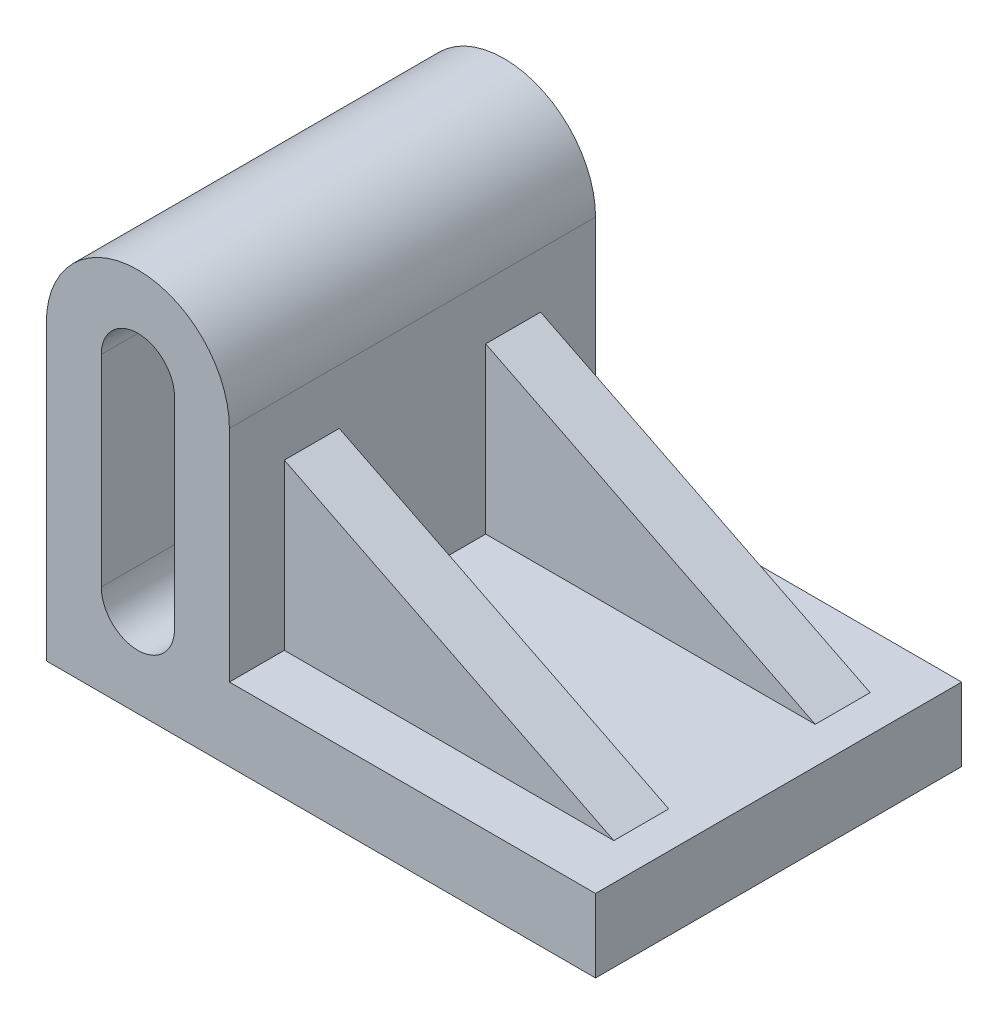
ISO-10303-21;
HEADER;
FILE_DESCRIPTION(('STEP AP214'),'2;1');
FILE_NAME('part.step','',(''),(''),'','','');
FILE_SCHEMA(('AUTOMOTIVE_DESIGN { 1 0 10303 214 1 1 1 1 }'));
ENDSEC;
DATA;
#1=APPLICATION_CONTEXT('core data for automotive mechanical design processes');
#2=APPLICATION_PROTOCOL_DEFINITION('international standard','automotive_design',2000,#1);
#3=PRODUCT_CONTEXT('',#1,'mechanical');
#4=PRODUCT('Part','Part','',(#3));
#5=PRODUCT_RELATED_PRODUCT_CATEGORY('part','',(#4));
#6=PRODUCT_DEFINITION_FORMATION('','',#4);
#7=PRODUCT_DEFINITION_CONTEXT('part definition',#1,'design');
#8=PRODUCT_DEFINITION('design','',#6,#7);
#9=PRODUCT_DEFINITION_SHAPE('','',#8);
#10=(LENGTH_UNIT() NAMED_UNIT(*) SI_UNIT(.MILLI.,.METRE.));
#11=(NAMED_UNIT(*) PLANE_ANGLE_UNIT() SI_UNIT($,.RADIAN.));
#12=(NAMED_UNIT(*) SI_UNIT($,.STERADIAN.) SOLID_ANGLE_UNIT());
#13=UNCERTAINTY_MEASURE_WITH_UNIT(LENGTH_MEASURE(1.E-05),#10,'distance_accuracy_value','');
#14=(GEOMETRIC_REPRESENTATION_CONTEXT(3) GLOBAL_UNCERTAINTY_ASSIGNED_CONTEXT((#13)) GLOBAL_UNIT_ASSIGNED_CONTEXT((#10,
#11,#12)) REPRESENTATION_CONTEXT('',''));
#15=CARTESIAN_POINT('',(0.,0.,0.));
#16=DIRECTION('',(0.,0.,1.));
#17=DIRECTION('',(1.,0.,0.));
#18=AXIS2_PLACEMENT_3D('',#15,#16,#17);
#19=CARTESIAN_POINT('',(140.,20.,-35.));
#20=DIRECTION('',(0.447213595499958,0.894427190999916,0.));
#21=DIRECTION('',(-0.894427190999916,0.447213595499958,0.));
#22=AXIS2_PLACEMENT_3D('',#19,#20,#21);
#23=PLANE('',#22);
#24=DIRECTION('',(0.,0.,1.));
#25=VECTOR('',#24,1.);
#26=CARTESIAN_POINT('',(140.,20.,-35.));
#27=LINE('',#26,#25);
#28=CARTESIAN_POINT('',(140.,20.,20.));
#29=VERTEX_POINT('',#28);
#30=CARTESIAN_POINT('',(140.,20.,35.));
#31=VERTEX_POINT('',#30);
#32=EDGE_CURVE('E211',#29,#31,#27,.T.);
#33=ORIENTED_EDGE('',*,*,#32,.F.);
#34=DIRECTION('',(-0.894427190999916,0.447213595499958,0.));
#35=VECTOR('',#34,1.);
#36=CARTESIAN_POINT('',(140.,20.,20.));
#37=LINE('',#36,#35);
#38=CARTESIAN_POINT('',(50.,65.,20.));
#39=VERTEX_POINT('',#38);
#40=EDGE_CURVE('E11',#29,#39,#37,.T.);
#41=ORIENTED_EDGE('',*,*,#40,.T.);
#42=DIRECTION('',(0.,0.,1.));
#43=VECTOR('',#42,1.);
#44=CARTESIAN_POINT('',(50.,65.,-35.));
#45=LINE('',#44,#43);
#46=CARTESIAN_POINT('',(50.,65.,35.));
#47=VERTEX_POINT('',#46);
#48=EDGE_CURVE('E68',#39,#47,#45,.T.);
#49=ORIENTED_EDGE('',*,*,#48,.T.);
#50=DIRECTION('',(-0.894427190999916,0.447213595499958,0.));
#51=VECTOR('',#50,1.);
#52=CARTESIAN_POINT('',(140.,20.,35.));
#53=LINE('',#52,#51);
#54=EDGE_CURVE('E168',#31,#47,#53,.T.);
#55=ORIENTED_EDGE('',*,*,#54,.F.);
#56=EDGE_LOOP('',(#33,#41,#49,#55));
#57=FACE_BOUND('',#56,.T.);
#58=ADVANCED_FACE('F45',(#57),#23,.T.);
#59=CARTESIAN_POINT('',(50.,65.,-35.));
#60=VERTEX_POINT('',#59);
#61=CARTESIAN_POINT('',(50.,65.,-20.));
#62=VERTEX_POINT('',#61);
#63=EDGE_CURVE('E212',#60,#62,#45,.T.);
#64=ORIENTED_EDGE('',*,*,#63,.T.);
#65=DIRECTION('',(0.894427190999916,-0.447213595499958,0.));
#66=VECTOR('',#65,1.);
#67=CARTESIAN_POINT('',(140.,20.,-20.));
#68=LINE('',#67,#66);
#69=CARTESIAN_POINT('',(140.,20.,-20.));
#70=VERTEX_POINT('',#69);
#71=EDGE_CURVE('E54',#62,#70,#68,.T.);
#72=ORIENTED_EDGE('',*,*,#71,.T.);
#73=CARTESIAN_POINT('',(140.,20.,-35.));
#74=VERTEX_POINT('',#73);
#75=EDGE_CURVE('E207',#74,#70,#27,.T.);
#76=ORIENTED_EDGE('',*,*,#75,.F.);
#77=DIRECTION('',(-0.894427190999916,0.447213595499958,0.));
#78=VECTOR('',#77,1.);
#79=CARTESIAN_POINT('',(140.,20.,-35.));
#80=LINE('',#79,#78);
#81=EDGE_CURVE('E195',#74,#60,#80,.T.);
#82=ORIENTED_EDGE('',*,*,#81,.T.);
#83=EDGE_LOOP('',(#64,#72,#76,#82));
#84=FACE_BOUND('',#83,.T.);
#85=ADVANCED_FACE('F323',(#84),#23,.T.);
#86=CARTESIAN_POINT('',(0.,20.,50.));
#87=DIRECTION('',(0.,-1.,0.));
#88=DIRECTION('',(1.,0.,0.));
#89=AXIS2_PLACEMENT_3D('',#86,#87,#88);
#90=PLANE('',#89);
#91=DIRECTION('',(0.,0.,-1.));
#92=VECTOR('',#91,1.);
#93=CARTESIAN_POINT('',(150.,20.,50.));
#94=LINE('',#93,#92);
#95=CARTESIAN_POINT('',(150.,20.,50.));
#96=VERTEX_POINT('',#95);
#97=CARTESIAN_POINT('',(150.,20.,-50.));
#98=VERTEX_POINT('',#97);
#99=EDGE_CURVE('E309',#96,#98,#94,.T.);
#100=ORIENTED_EDGE('',*,*,#99,.T.);
#101=DIRECTION('',(-1.,0.,0.));
#102=VECTOR('',#101,1.);
#103=CARTESIAN_POINT('',(0.,20.,-50.));
#104=LINE('',#103,#102);
#105=CARTESIAN_POINT('',(50.,20.,-50.));
#106=VERTEX_POINT('',#105);
#107=EDGE_CURVE('E275',#98,#106,#104,.T.);
#108=ORIENTED_EDGE('',*,*,#107,.T.);
#109=DIRECTION('',(0.,0.,-1.));
#110=VECTOR('',#109,1.);
#111=CARTESIAN_POINT('',(50.,20.,50.));
#112=LINE('',#111,#110);
#113=CARTESIAN_POINT('',(50.,20.,-35.));
#114=VERTEX_POINT('',#113);
#115=EDGE_CURVE('E304',#114,#106,#112,.T.);
#116=ORIENTED_EDGE('',*,*,#115,.F.);
#117=DIRECTION('',(1.,0.,0.));
#118=VECTOR('',#117,1.);
#119=CARTESIAN_POINT('',(50.,20.,-35.));
#120=LINE('',#119,#118);
#121=EDGE_CURVE('E203',#114,#74,#120,.T.);
#122=ORIENTED_EDGE('',*,*,#121,.T.);
#123=ORIENTED_EDGE('',*,*,#75,.T.);
#124=DIRECTION('',(-1.,0.,0.));
#125=VECTOR('',#124,1.);
#126=CARTESIAN_POINT('',(50.,20.,-20.));
#127=LINE('',#126,#125);
#128=CARTESIAN_POINT('',(50.,20.,-20.));
#129=VERTEX_POINT('',#128);
#130=EDGE_CURVE('E174',#70,#129,#127,.T.);
#131=ORIENTED_EDGE('',*,*,#130,.T.);
#132=DIRECTION('',(0.,0.,1.));
#133=VECTOR('',#132,1.);
#134=CARTESIAN_POINT('',(50.,20.,-20.));
#135=LINE('',#134,#133);
#136=CARTESIAN_POINT('',(50.,20.,20.));
#137=VERTEX_POINT('',#136);
#138=EDGE_CURVE('E164',#129,#137,#135,.T.);
#139=ORIENTED_EDGE('',*,*,#138,.T.);
#140=DIRECTION('',(1.,0.,0.));
#141=VECTOR('',#140,1.);
#142=CARTESIAN_POINT('',(50.,20.,20.));
#143=LINE('',#142,#141);
#144=EDGE_CURVE('E61',#137,#29,#143,.T.);
#145=ORIENTED_EDGE('',*,*,#144,.T.);
#146=ORIENTED_EDGE('',*,*,#32,.T.);
#147=DIRECTION('',(1.,0.,0.));
#148=VECTOR('',#147,1.);
#149=CARTESIAN_POINT('',(50.,20.,35.));
#150=LINE('',#149,#148);
#151=CARTESIAN_POINT('',(50.,20.,35.));
#152=VERTEX_POINT('',#151);
#153=EDGE_CURVE('E191',#152,#31,#150,.T.);
#154=ORIENTED_EDGE('',*,*,#153,.F.);
#155=CARTESIAN_POINT('',(50.,20.,50.));
#156=VERTEX_POINT('',#155);
#157=EDGE_CURVE('E305',#156,#152,#112,.T.);
#158=ORIENTED_EDGE('',*,*,#157,.F.);
#159=DIRECTION('',(-1.,0.,0.));
#160=VECTOR('',#159,1.);
#161=CARTESIAN_POINT('',(0.,20.,50.));
#162=LINE('',#161,#160);
#163=EDGE_CURVE('E295',#96,#156,#162,.T.);
#164=ORIENTED_EDGE('',*,*,#163,.F.);
#165=EDGE_LOOP('',(#100,#108,#116,#122,#123,#131,#139,#145,#146,#154,#158,#164));
#166=FACE_BOUND('',#165,.T.);
#167=ADVANCED_FACE('F177',(#166),#90,.F.);
#168=CARTESIAN_POINT('',(50.,0.,50.));
#169=DIRECTION('',(-1.,0.,0.));
#170=DIRECTION('',(0.,0.,1.));
#171=AXIS2_PLACEMENT_3D('',#168,#169,#170);
#172=PLANE('',#171);
#173=DIRECTION('',(0.,1.,0.));
#174=VECTOR('',#173,1.);
#175=CARTESIAN_POINT('',(50.,0.,-50.));
#176=LINE('',#175,#174);
#177=CARTESIAN_POINT('',(50.,80.,-50.));
#178=VERTEX_POINT('',#177);
#179=EDGE_CURVE('E279',#106,#178,#176,.T.);
#180=ORIENTED_EDGE('',*,*,#179,.T.);
#181=DIRECTION('',(0.,0.,-1.));
#182=VECTOR('',#181,1.);
#183=CARTESIAN_POINT('',(50.,80.,50.));
#184=LINE('',#183,#182);
#185=CARTESIAN_POINT('',(50.,80.,50.));
#186=VERTEX_POINT('',#185);
#187=EDGE_CURVE('E301',#186,#178,#184,.T.);
#188=ORIENTED_EDGE('',*,*,#187,.F.);
#189=DIRECTION('',(0.,1.,0.));
#190=VECTOR('',#189,1.);
#191=CARTESIAN_POINT('',(50.,0.,50.));
#192=LINE('',#191,#190);
#193=EDGE_CURVE('E298',#156,#186,#192,.T.);
#194=ORIENTED_EDGE('',*,*,#193,.F.);
#195=ORIENTED_EDGE('',*,*,#157,.T.);
#196=DIRECTION('',(0.,-1.,0.));
#197=VECTOR('',#196,1.);
#198=CARTESIAN_POINT('',(50.,65.,35.));
#199=LINE('',#198,#197);
#200=EDGE_CURVE('E188',#47,#152,#199,.T.);
#201=ORIENTED_EDGE('',*,*,#200,.F.);
#202=ORIENTED_EDGE('',*,*,#48,.F.);
#203=DIRECTION('',(0.,-1.,0.));
#204=VECTOR('',#203,1.);
#205=CARTESIAN_POINT('',(50.,105.,20.));
#206=LINE('',#205,#204);
#207=EDGE_CURVE('E160',#39,#137,#206,.T.);
#208=ORIENTED_EDGE('',*,*,#207,.T.);
#209=ORIENTED_EDGE('',*,*,#138,.F.);
#210=DIRECTION('',(0.,-1.,0.));
#211=VECTOR('',#210,1.);
#212=CARTESIAN_POINT('',(50.,105.,-20.));
#213=LINE('',#212,#211);
#214=EDGE_CURVE('E169',#62,#129,#213,.T.);
#215=ORIENTED_EDGE('',*,*,#214,.F.);
#216=ORIENTED_EDGE('',*,*,#63,.F.);
#217=DIRECTION('',(0.,-1.,0.));
#218=VECTOR('',#217,1.);
#219=CARTESIAN_POINT('',(50.,65.,-35.));
#220=LINE('',#219,#218);
#221=EDGE_CURVE('E199',#60,#114,#220,.T.);
#222=ORIENTED_EDGE('',*,*,#221,.T.);
#223=ORIENTED_EDGE('',*,*,#115,.T.);
#224=EDGE_LOOP('',(#180,#188,#194,#195,#201,#202,#208,#209,#215,#216,#222,#223));
#225=FACE_BOUND('',#224,.T.);
#226=ADVANCED_FACE('F162',(#225),#172,.F.);
#227=CARTESIAN_POINT('',(25.,80.,50.));
#228=DIRECTION('',(0.,0.,-1.));
#229=DIRECTION('',(-1.,0.,0.));
#230=AXIS2_PLACEMENT_3D('',#227,#228,#229);
#231=CYLINDRICAL_SURFACE('',#230,25.);
#232=ORIENTED_EDGE('',*,*,#187,.T.);
#233=CARTESIAN_POINT('',(25.,80.,-50.));
#234=DIRECTION('',(0.,0.,1.));
#235=DIRECTION('',(1.,0.,0.));
#236=AXIS2_PLACEMENT_3D('',#233,#234,#235);
#237=CIRCLE('',#236,25.);
#238=CARTESIAN_POINT('',(0.,80.,-50.));
#239=VERTEX_POINT('',#238);
#240=EDGE_CURVE('E250',#178,#239,#237,.T.);
#241=ORIENTED_EDGE('',*,*,#240,.T.);
#242=DIRECTION('',(0.,0.,-1.));
#243=VECTOR('',#242,1.);
#244=CARTESIAN_POINT('',(0.,80.,50.));
#245=LINE('',#244,#243);
#246=CARTESIAN_POINT('',(0.,80.,50.));
#247=VERTEX_POINT('',#246);
#248=EDGE_CURVE('E318',#247,#239,#245,.T.);
#249=ORIENTED_EDGE('',*,*,#248,.F.);
#250=CARTESIAN_POINT('',(25.,80.,50.));
#251=DIRECTION('',(0.,0.,1.));
#252=DIRECTION('',(1.,0.,0.));
#253=AXIS2_PLACEMENT_3D('',#250,#251,#252);
#254=CIRCLE('',#253,25.);
#255=EDGE_CURVE('E282',#186,#247,#254,.T.);
#256=ORIENTED_EDGE('',*,*,#255,.F.);
#257=EDGE_LOOP('',(#232,#241,#249,#256));
#258=FACE_BOUND('',#257,.T.);
#259=ADVANCED_FACE('F47',(#258),#231,.T.);
#260=CARTESIAN_POINT('',(0.,0.,50.));
#261=DIRECTION('',(1.,0.,0.));
#262=DIRECTION('',(0.,0.,-1.));
#263=AXIS2_PLACEMENT_3D('',#260,#261,#262);
#264=PLANE('',#263);
#265=ORIENTED_EDGE('',*,*,#248,.T.);
#266=DIRECTION('',(0.,-1.,0.));
#267=VECTOR('',#266,1.);
#268=CARTESIAN_POINT('',(0.,0.,-50.));
#269=LINE('',#268,#267);
#270=CARTESIAN_POINT('',(0.,0.,-50.));
#271=VERTEX_POINT('',#270);
#272=EDGE_CURVE('E263',#239,#271,#269,.T.);
#273=ORIENTED_EDGE('',*,*,#272,.T.);
#274=DIRECTION('',(0.,0.,-1.));
#275=VECTOR('',#274,1.);
#276=CARTESIAN_POINT('',(0.,0.,50.));
#277=LINE('',#276,#275);
#278=CARTESIAN_POINT('',(0.,0.,50.));
#279=VERTEX_POINT('',#278);
#280=EDGE_CURVE('E315',#279,#271,#277,.T.);
#281=ORIENTED_EDGE('',*,*,#280,.F.);
#282=DIRECTION('',(0.,-1.,0.));
#283=VECTOR('',#282,1.);
#284=CARTESIAN_POINT('',(0.,0.,50.));
#285=LINE('',#284,#283);
#286=EDGE_CURVE('E286',#247,#279,#285,.T.);
#287=ORIENTED_EDGE('',*,*,#286,.F.);
#288=EDGE_LOOP('',(#265,#273,#281,#287));
#289=FACE_BOUND('',#288,.T.);
#290=ADVANCED_FACE('F381',(#289),#264,.F.);
#291=CARTESIAN_POINT('',(0.,0.,50.));
#292=DIRECTION('',(0.,1.,0.));
#293=DIRECTION('',(0.,0.,1.));
#294=AXIS2_PLACEMENT_3D('',#291,#292,#293);
#295=PLANE('',#294);
#296=ORIENTED_EDGE('',*,*,#280,.T.);
#297=DIRECTION('',(1.,0.,0.));
#298=VECTOR('',#297,1.);
#299=CARTESIAN_POINT('',(0.,0.,-50.));
#300=LINE('',#299,#298);
#301=CARTESIAN_POINT('',(150.,0.,-50.));
#302=VERTEX_POINT('',#301);
#303=EDGE_CURVE('E267',#271,#302,#300,.T.);
#304=ORIENTED_EDGE('',*,*,#303,.T.);
#305=DIRECTION('',(0.,0.,-1.));
#306=VECTOR('',#305,1.);
#307=CARTESIAN_POINT('',(150.,0.,50.));
#308=LINE('',#307,#306);
#309=CARTESIAN_POINT('',(150.,0.,50.));
#310=VERTEX_POINT('',#309);
#311=EDGE_CURVE('E312',#310,#302,#308,.T.);
#312=ORIENTED_EDGE('',*,*,#311,.F.);
#313=DIRECTION('',(1.,0.,0.));
#314=VECTOR('',#313,1.);
#315=CARTESIAN_POINT('',(0.,0.,50.));
#316=LINE('',#315,#314);
#317=EDGE_CURVE('E289',#279,#310,#316,.T.);
#318=ORIENTED_EDGE('',*,*,#317,.F.);
#319=EDGE_LOOP('',(#296,#304,#312,#318));
#320=FACE_BOUND('',#319,.T.);
#321=ADVANCED_FACE('F378',(#320),#295,.F.);
#322=CARTESIAN_POINT('',(150.,0.,50.));
#323=DIRECTION('',(-1.,0.,0.));
#324=DIRECTION('',(0.,0.,1.));
#325=AXIS2_PLACEMENT_3D('',#322,#323,#324);
#326=PLANE('',#325);
#327=ORIENTED_EDGE('',*,*,#311,.T.);
#328=DIRECTION('',(0.,1.,0.));
#329=VECTOR('',#328,1.);
#330=CARTESIAN_POINT('',(150.,0.,-50.));
#331=LINE('',#330,#329);
#332=EDGE_CURVE('E271',#302,#98,#331,.T.);
#333=ORIENTED_EDGE('',*,*,#332,.T.);
#334=ORIENTED_EDGE('',*,*,#99,.F.);
#335=DIRECTION('',(0.,1.,0.));
#336=VECTOR('',#335,1.);
#337=CARTESIAN_POINT('',(150.,0.,50.));
#338=LINE('',#337,#336);
#339=EDGE_CURVE('E292',#310,#96,#338,.T.);
#340=ORIENTED_EDGE('',*,*,#339,.F.);
#341=EDGE_LOOP('',(#327,#333,#334,#340));
#342=FACE_BOUND('',#341,.T.);
#343=ADVANCED_FACE('F370',(#342),#326,.F.);
#344=CARTESIAN_POINT('',(0.,0.,50.));
#345=DIRECTION('',(0.,0.,1.));
#346=DIRECTION('',(1.,0.,0.));
#347=AXIS2_PLACEMENT_3D('',#344,#345,#346);
#348=PLANE('',#347);
#349=CARTESIAN_POINT('',(25.,80.,50.));
#350=DIRECTION('',(0.,0.,1.));
#351=DIRECTION('',(1.,0.,0.));
#352=AXIS2_PLACEMENT_3D('',#349,#350,#351);
#353=CIRCLE('',#352,10.);
#354=CARTESIAN_POINT('',(35.,80.,50.));
#355=VERTEX_POINT('',#354);
#356=CARTESIAN_POINT('',(15.,80.,50.));
#357=VERTEX_POINT('',#356);
#358=EDGE_CURVE('E210',#355,#357,#353,.T.);
#359=ORIENTED_EDGE('',*,*,#358,.F.);
#360=DIRECTION('',(0.,1.,0.));
#361=VECTOR('',#360,1.);
#362=CARTESIAN_POINT('',(35.,80.,50.));
#363=LINE('',#362,#361);
#364=CARTESIAN_POINT('',(35.,25.,50.));
#365=VERTEX_POINT('',#364);
#366=EDGE_CURVE('E221',#365,#355,#363,.T.);
#367=ORIENTED_EDGE('',*,*,#366,.F.);
#368=CARTESIAN_POINT('',(25.,25.,50.));
#369=DIRECTION('',(0.,0.,1.));
#370=DIRECTION('',(1.,0.,0.));
#371=AXIS2_PLACEMENT_3D('',#368,#369,#370);
#372=CIRCLE('',#371,10.);
#373=CARTESIAN_POINT('',(15.,25.,50.));
#374=VERTEX_POINT('',#373);
#375=EDGE_CURVE('E240',#374,#365,#372,.T.);
#376=ORIENTED_EDGE('',*,*,#375,.F.);
#377=DIRECTION('',(0.,-1.,0.));
#378=VECTOR('',#377,1.);
#379=CARTESIAN_POINT('',(15.,80.,50.));
#380=LINE('',#379,#378);
#381=EDGE_CURVE('E236',#357,#374,#380,.T.);
#382=ORIENTED_EDGE('',*,*,#381,.F.);
#383=EDGE_LOOP('',(#359,#367,#376,#382));
#384=FACE_BOUND('',#383,.T.);
#385=ORIENTED_EDGE('',*,*,#255,.T.);
#386=ORIENTED_EDGE('',*,*,#286,.T.);
#387=ORIENTED_EDGE('',*,*,#317,.T.);
#388=ORIENTED_EDGE('',*,*,#339,.T.);
#389=ORIENTED_EDGE('',*,*,#163,.T.);
#390=ORIENTED_EDGE('',*,*,#193,.T.);
#391=EDGE_LOOP('',(#385,#386,#387,#388,#389,#390));
#392=FACE_BOUND('',#391,.T.);
#393=ADVANCED_FACE('F366',(#384,#392),#348,.T.);
#394=CARTESIAN_POINT('',(0.,0.,-50.));
#395=DIRECTION('',(0.,0.,1.));
#396=DIRECTION('',(1.,0.,0.));
#397=AXIS2_PLACEMENT_3D('',#394,#395,#396);
#398=PLANE('',#397);
#399=DIRECTION('',(0.,1.,0.));
#400=VECTOR('',#399,1.);
#401=CARTESIAN_POINT('',(35.,80.,-50.));
#402=LINE('',#401,#400);
#403=CARTESIAN_POINT('',(35.,25.,-50.));
#404=VERTEX_POINT('',#403);
#405=CARTESIAN_POINT('',(35.,80.,-50.));
#406=VERTEX_POINT('',#405);
#407=EDGE_CURVE('E229',#404,#406,#402,.T.);
#408=ORIENTED_EDGE('',*,*,#407,.T.);
#409=CARTESIAN_POINT('',(25.,80.,-50.));
#410=DIRECTION('',(0.,0.,1.));
#411=DIRECTION('',(1.,0.,0.));
#412=AXIS2_PLACEMENT_3D('',#409,#410,#411);
#413=CIRCLE('',#412,10.);
#414=CARTESIAN_POINT('',(15.,80.,-50.));
#415=VERTEX_POINT('',#414);
#416=EDGE_CURVE('E216',#406,#415,#413,.T.);
#417=ORIENTED_EDGE('',*,*,#416,.T.);
#418=DIRECTION('',(0.,-1.,0.));
#419=VECTOR('',#418,1.);
#420=CARTESIAN_POINT('',(15.,80.,-50.));
#421=LINE('',#420,#419);
#422=CARTESIAN_POINT('',(15.,25.,-50.));
#423=VERTEX_POINT('',#422);
#424=EDGE_CURVE('E220',#415,#423,#421,.T.);
#425=ORIENTED_EDGE('',*,*,#424,.T.);
#426=CARTESIAN_POINT('',(25.,25.,-50.));
#427=DIRECTION('',(0.,0.,1.));
#428=DIRECTION('',(1.,0.,0.));
#429=AXIS2_PLACEMENT_3D('',#426,#427,#428);
#430=CIRCLE('',#429,10.);
#431=EDGE_CURVE('E225',#423,#404,#430,.T.);
#432=ORIENTED_EDGE('',*,*,#431,.T.);
#433=EDGE_LOOP('',(#408,#417,#425,#432));
#434=FACE_BOUND('',#433,.T.);
#435=ORIENTED_EDGE('',*,*,#240,.F.);
#436=ORIENTED_EDGE('',*,*,#179,.F.);
#437=ORIENTED_EDGE('',*,*,#107,.F.);
#438=ORIENTED_EDGE('',*,*,#332,.F.);
#439=ORIENTED_EDGE('',*,*,#303,.F.);
#440=ORIENTED_EDGE('',*,*,#272,.F.);
#441=EDGE_LOOP('',(#435,#436,#437,#438,#439,#440));
#442=FACE_BOUND('',#441,.T.);
#443=ADVANCED_FACE('F362',(#434,#442),#398,.F.);
#444=CARTESIAN_POINT('',(25.,80.,-50.));
#445=DIRECTION('',(0.,0.,1.));
#446=DIRECTION('',(1.,0.,0.));
#447=AXIS2_PLACEMENT_3D('',#444,#445,#446);
#448=CYLINDRICAL_SURFACE('',#447,10.);
#449=ORIENTED_EDGE('',*,*,#358,.T.);
#450=DIRECTION('',(0.,0.,1.));
#451=VECTOR('',#450,1.);
#452=CARTESIAN_POINT('',(15.,80.,-50.));
#453=LINE('',#452,#451);
#454=EDGE_CURVE('E233',#415,#357,#453,.T.);
#455=ORIENTED_EDGE('',*,*,#454,.F.);
#456=ORIENTED_EDGE('',*,*,#416,.F.);
#457=DIRECTION('',(0.,0.,1.));
#458=VECTOR('',#457,1.);
#459=CARTESIAN_POINT('',(35.,80.,-50.));
#460=LINE('',#459,#458);
#461=EDGE_CURVE('E247',#406,#355,#460,.T.);
#462=ORIENTED_EDGE('',*,*,#461,.T.);
#463=EDGE_LOOP('',(#449,#455,#456,#462));
#464=FACE_BOUND('',#463,.T.);
#465=ADVANCED_FACE('F351',(#464),#448,.F.);
#466=CARTESIAN_POINT('',(35.,80.,-50.));
#467=DIRECTION('',(1.,0.,0.));
#468=DIRECTION('',(0.,1.,0.));
#469=AXIS2_PLACEMENT_3D('',#466,#467,#468);
#470=PLANE('',#469);
#471=ORIENTED_EDGE('',*,*,#366,.T.);
#472=ORIENTED_EDGE('',*,*,#461,.F.);
#473=ORIENTED_EDGE('',*,*,#407,.F.);
#474=DIRECTION('',(0.,0.,1.));
#475=VECTOR('',#474,1.);
#476=CARTESIAN_POINT('',(35.,25.,-50.));
#477=LINE('',#476,#475);
#478=EDGE_CURVE('E251',#404,#365,#477,.T.);
#479=ORIENTED_EDGE('',*,*,#478,.T.);
#480=EDGE_LOOP('',(#471,#472,#473,#479));
#481=FACE_BOUND('',#480,.T.);
#482=ADVANCED_FACE('F347',(#481),#470,.F.);
#483=CARTESIAN_POINT('',(25.,25.,-50.));
#484=DIRECTION('',(0.,0.,1.));
#485=DIRECTION('',(1.,0.,0.));
#486=AXIS2_PLACEMENT_3D('',#483,#484,#485);
#487=CYLINDRICAL_SURFACE('',#486,10.);
#488=ORIENTED_EDGE('',*,*,#375,.T.);
#489=ORIENTED_EDGE('',*,*,#478,.F.);
#490=ORIENTED_EDGE('',*,*,#431,.F.);
#491=DIRECTION('',(0.,0.,1.));
#492=VECTOR('',#491,1.);
#493=CARTESIAN_POINT('',(15.,25.,-50.));
#494=LINE('',#493,#492);
#495=EDGE_CURVE('E254',#423,#374,#494,.T.);
#496=ORIENTED_EDGE('',*,*,#495,.T.);
#497=EDGE_LOOP('',(#488,#489,#490,#496));
#498=FACE_BOUND('',#497,.T.);
#499=ADVANCED_FACE('F350',(#498),#487,.F.);
#500=CARTESIAN_POINT('',(15.,80.,-50.));
#501=DIRECTION('',(-1.,0.,0.));
#502=DIRECTION('',(0.,0.,1.));
#503=AXIS2_PLACEMENT_3D('',#500,#501,#502);
#504=PLANE('',#503);
#505=ORIENTED_EDGE('',*,*,#381,.T.);
#506=ORIENTED_EDGE('',*,*,#495,.F.);
#507=ORIENTED_EDGE('',*,*,#424,.F.);
#508=ORIENTED_EDGE('',*,*,#454,.T.);
#509=EDGE_LOOP('',(#505,#506,#507,#508));
#510=FACE_BOUND('',#509,.T.);
#511=ADVANCED_FACE('F355',(#510),#504,.F.);
#512=CARTESIAN_POINT('',(0.,0.,-35.));
#513=DIRECTION('',(0.,0.,1.));
#514=DIRECTION('',(1.,0.,0.));
#515=AXIS2_PLACEMENT_3D('',#512,#513,#514);
#516=PLANE('',#515);
#517=ORIENTED_EDGE('',*,*,#81,.F.);
#518=ORIENTED_EDGE('',*,*,#121,.F.);
#519=ORIENTED_EDGE('',*,*,#221,.F.);
#520=EDGE_LOOP('',(#517,#518,#519));
#521=FACE_BOUND('',#520,.T.);
#522=ADVANCED_FACE('F329',(#521),#516,.F.);
#523=CARTESIAN_POINT('',(0.,0.,35.));
#524=DIRECTION('',(0.,0.,1.));
#525=DIRECTION('',(1.,0.,0.));
#526=AXIS2_PLACEMENT_3D('',#523,#524,#525);
#527=PLANE('',#526);
#528=ORIENTED_EDGE('',*,*,#54,.T.);
#529=ORIENTED_EDGE('',*,*,#200,.T.);
#530=ORIENTED_EDGE('',*,*,#153,.T.);
#531=EDGE_LOOP('',(#528,#529,#530));
#532=FACE_BOUND('',#531,.T.);
#533=ADVANCED_FACE('F336',(#532),#527,.T.);
#534=CARTESIAN_POINT('',(50.,105.,20.));
#535=DIRECTION('',(0.,0.,-1.));
#536=DIRECTION('',(-1.,0.,0.));
#537=AXIS2_PLACEMENT_3D('',#534,#535,#536);
#538=PLANE('',#537);
#539=ORIENTED_EDGE('',*,*,#144,.F.);
#540=ORIENTED_EDGE('',*,*,#207,.F.);
#541=ORIENTED_EDGE('',*,*,#40,.F.);
#542=EDGE_LOOP('',(#539,#540,#541));
#543=FACE_BOUND('',#542,.T.);
#544=ADVANCED_FACE('F171',(#543),#538,.T.);
#545=CARTESIAN_POINT('',(50.,105.,-20.));
#546=DIRECTION('',(0.,0.,1.));
#547=DIRECTION('',(1.,0.,0.));
#548=AXIS2_PLACEMENT_3D('',#545,#546,#547);
#549=PLANE('',#548);
#550=ORIENTED_EDGE('',*,*,#214,.T.);
#551=ORIENTED_EDGE('',*,*,#130,.F.);
#552=ORIENTED_EDGE('',*,*,#71,.F.);
#553=EDGE_LOOP('',(#550,#551,#552));
#554=FACE_BOUND('',#553,.T.);
#555=ADVANCED_FACE('F330',(#554),#549,.T.);
#556=CLOSED_SHELL('',(#58,#85,#167,#226,#259,#290,#321,#343,#393,#443,#465,#482,#499,#511,#522,
#533,#544,#555));
#557=MANIFOLD_SOLID_BREP('B2',#556);
#558=ADVANCED_BREP_SHAPE_REPRESENTATION('',(#18,#557),#14);
#559=SHAPE_DEFINITION_REPRESENTATION(#9,#558);
ENDSEC;
END-ISO-10303-21;
